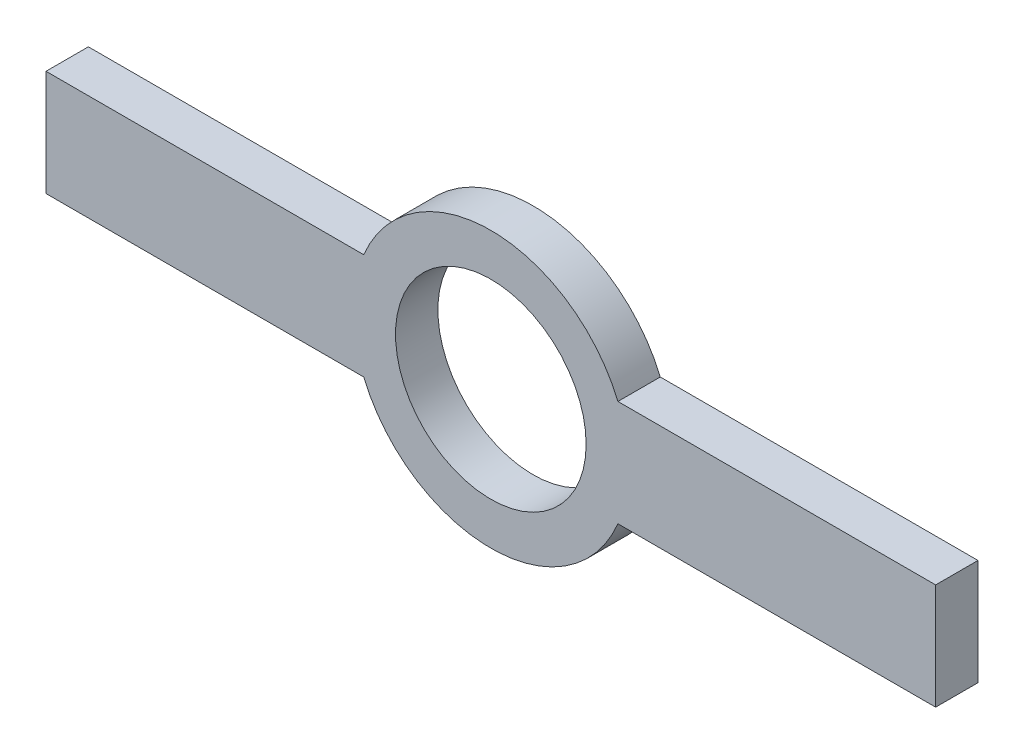
ISO-10303-21;
HEADER;
FILE_DESCRIPTION(('STEP AP214'),'2;1');
FILE_NAME('part.step','',(''),(''),'','','');
FILE_SCHEMA(('AUTOMOTIVE_DESIGN { 1 0 10303 214 1 1 1 1 }'));
ENDSEC;
DATA;
#1=APPLICATION_CONTEXT('core data for automotive mechanical design processes');
#2=APPLICATION_PROTOCOL_DEFINITION('international standard','automotive_design',2000,#1);
#3=PRODUCT_CONTEXT('',#1,'mechanical');
#4=PRODUCT('Part','Part','',(#3));
#5=PRODUCT_RELATED_PRODUCT_CATEGORY('part','',(#4));
#6=PRODUCT_DEFINITION_FORMATION('','',#4);
#7=PRODUCT_DEFINITION_CONTEXT('part definition',#1,'design');
#8=PRODUCT_DEFINITION('design','',#6,#7);
#9=PRODUCT_DEFINITION_SHAPE('','',#8);
#10=(LENGTH_UNIT() NAMED_UNIT(*) SI_UNIT(.MILLI.,.METRE.));
#11=(NAMED_UNIT(*) PLANE_ANGLE_UNIT() SI_UNIT($,.RADIAN.));
#12=(NAMED_UNIT(*) SI_UNIT($,.STERADIAN.) SOLID_ANGLE_UNIT());
#13=UNCERTAINTY_MEASURE_WITH_UNIT(LENGTH_MEASURE(1.E-05),#10,'distance_accuracy_value','');
#14=(GEOMETRIC_REPRESENTATION_CONTEXT(3) GLOBAL_UNCERTAINTY_ASSIGNED_CONTEXT((#13)) GLOBAL_UNIT_ASSIGNED_CONTEXT((#10,
#11,#12)) REPRESENTATION_CONTEXT('',''));
#15=CARTESIAN_POINT('',(0.,0.,0.));
#16=DIRECTION('',(0.,0.,1.));
#17=DIRECTION('',(1.,0.,0.));
#18=AXIS2_PLACEMENT_3D('',#15,#16,#17);
#19=CARTESIAN_POINT('',(0.,-2.5,2.));
#20=DIRECTION('',(0.,1.,0.));
#21=DIRECTION('',(0.,0.,1.));
#22=AXIS2_PLACEMENT_3D('',#19,#20,#21);
#23=PLANE('',#22);
#24=DIRECTION('',(1.,0.,0.));
#25=VECTOR('',#24,1.);
#26=CARTESIAN_POINT('',(0.,-2.5,0.));
#27=LINE('',#26,#25);
#28=CARTESIAN_POINT('',(-21.,-2.5,0.));
#29=VERTEX_POINT('',#28);
#30=CARTESIAN_POINT('',(-6.,-2.5,0.));
#31=VERTEX_POINT('',#30);
#32=EDGE_CURVE('E131',#29,#31,#27,.T.);
#33=ORIENTED_EDGE('',*,*,#32,.T.);
#34=DIRECTION('',(0.,0.,-1.));
#35=VECTOR('',#34,1.);
#36=CARTESIAN_POINT('',(-6.,-2.5,2.));
#37=LINE('',#36,#35);
#38=CARTESIAN_POINT('',(-6.,-2.5,2.));
#39=VERTEX_POINT('',#38);
#40=EDGE_CURVE('E11',#39,#31,#37,.T.);
#41=ORIENTED_EDGE('',*,*,#40,.F.);
#42=DIRECTION('',(1.,0.,0.));
#43=VECTOR('',#42,1.);
#44=CARTESIAN_POINT('',(0.,-2.5,2.));
#45=LINE('',#44,#43);
#46=CARTESIAN_POINT('',(-21.,-2.5,2.));
#47=VERTEX_POINT('',#46);
#48=EDGE_CURVE('E150',#47,#39,#45,.T.);
#49=ORIENTED_EDGE('',*,*,#48,.F.);
#50=DIRECTION('',(0.,0.,-1.));
#51=VECTOR('',#50,1.);
#52=CARTESIAN_POINT('',(-21.,-2.5,2.));
#53=LINE('',#52,#51);
#54=EDGE_CURVE('E51',#47,#29,#53,.T.);
#55=ORIENTED_EDGE('',*,*,#54,.T.);
#56=EDGE_LOOP('',(#33,#41,#49,#55));
#57=FACE_BOUND('',#56,.T.);
#58=ADVANCED_FACE('F35',(#57),#23,.F.);
#59=CARTESIAN_POINT('',(0.,0.,2.));
#60=DIRECTION('',(0.,0.,-1.));
#61=DIRECTION('',(-1.,0.,0.));
#62=AXIS2_PLACEMENT_3D('',#59,#60,#61);
#63=CYLINDRICAL_SURFACE('',#62,6.5);
#64=CARTESIAN_POINT('',(0.,0.,0.));
#65=DIRECTION('',(0.,0.,1.));
#66=DIRECTION('',(1.,0.,0.));
#67=AXIS2_PLACEMENT_3D('',#64,#65,#66);
#68=CIRCLE('',#67,6.5);
#69=CARTESIAN_POINT('',(6.,-2.5,0.));
#70=VERTEX_POINT('',#69);
#71=EDGE_CURVE('E133',#31,#70,#68,.T.);
#72=ORIENTED_EDGE('',*,*,#71,.T.);
#73=DIRECTION('',(0.,0.,-1.));
#74=VECTOR('',#73,1.);
#75=CARTESIAN_POINT('',(6.,-2.5,2.));
#76=LINE('',#75,#74);
#77=CARTESIAN_POINT('',(6.,-2.5,2.));
#78=VERTEX_POINT('',#77);
#79=EDGE_CURVE('E43',#78,#70,#76,.T.);
#80=ORIENTED_EDGE('',*,*,#79,.F.);
#81=CARTESIAN_POINT('',(0.,0.,2.));
#82=DIRECTION('',(0.,0.,1.));
#83=DIRECTION('',(1.,0.,0.));
#84=AXIS2_PLACEMENT_3D('',#81,#82,#83);
#85=CIRCLE('',#84,6.5);
#86=EDGE_CURVE('E89',#39,#78,#85,.T.);
#87=ORIENTED_EDGE('',*,*,#86,.F.);
#88=ORIENTED_EDGE('',*,*,#40,.T.);
#89=EDGE_LOOP('',(#72,#80,#87,#88));
#90=FACE_BOUND('',#89,.T.);
#91=ADVANCED_FACE('F199',(#90),#63,.T.);
#92=CARTESIAN_POINT('',(0.,-2.5,2.));
#93=DIRECTION('',(0.,1.,0.));
#94=DIRECTION('',(0.,0.,1.));
#95=AXIS2_PLACEMENT_3D('',#92,#93,#94);
#96=PLANE('',#95);
#97=DIRECTION('',(1.,0.,0.));
#98=VECTOR('',#97,1.);
#99=CARTESIAN_POINT('',(0.,-2.5,0.));
#100=LINE('',#99,#98);
#101=CARTESIAN_POINT('',(21.,-2.5,0.));
#102=VERTEX_POINT('',#101);
#103=EDGE_CURVE('E136',#70,#102,#100,.T.);
#104=ORIENTED_EDGE('',*,*,#103,.T.);
#105=DIRECTION('',(0.,0.,-1.));
#106=VECTOR('',#105,1.);
#107=CARTESIAN_POINT('',(21.,-2.5,2.));
#108=LINE('',#107,#106);
#109=CARTESIAN_POINT('',(21.,-2.5,2.));
#110=VERTEX_POINT('',#109);
#111=EDGE_CURVE('E156',#110,#102,#108,.T.);
#112=ORIENTED_EDGE('',*,*,#111,.F.);
#113=DIRECTION('',(1.,0.,0.));
#114=VECTOR('',#113,1.);
#115=CARTESIAN_POINT('',(0.,-2.5,2.));
#116=LINE('',#115,#114);
#117=EDGE_CURVE('E164',#78,#110,#116,.T.);
#118=ORIENTED_EDGE('',*,*,#117,.F.);
#119=ORIENTED_EDGE('',*,*,#79,.T.);
#120=EDGE_LOOP('',(#104,#112,#118,#119));
#121=FACE_BOUND('',#120,.T.);
#122=ADVANCED_FACE('F162',(#121),#96,.F.);
#123=CARTESIAN_POINT('',(21.,0.,2.));
#124=DIRECTION('',(-1.,0.,0.));
#125=DIRECTION('',(0.,0.,1.));
#126=AXIS2_PLACEMENT_3D('',#123,#124,#125);
#127=PLANE('',#126);
#128=DIRECTION('',(0.,1.,0.));
#129=VECTOR('',#128,1.);
#130=CARTESIAN_POINT('',(21.,0.,0.));
#131=LINE('',#130,#129);
#132=CARTESIAN_POINT('',(21.,2.5,0.));
#133=VERTEX_POINT('',#132);
#134=EDGE_CURVE('E138',#102,#133,#131,.T.);
#135=ORIENTED_EDGE('',*,*,#134,.T.);
#136=DIRECTION('',(0.,0.,-1.));
#137=VECTOR('',#136,1.);
#138=CARTESIAN_POINT('',(21.,2.5,2.));
#139=LINE('',#138,#137);
#140=CARTESIAN_POINT('',(21.,2.5,2.));
#141=VERTEX_POINT('',#140);
#142=EDGE_CURVE('E154',#141,#133,#139,.T.);
#143=ORIENTED_EDGE('',*,*,#142,.F.);
#144=DIRECTION('',(0.,1.,0.));
#145=VECTOR('',#144,1.);
#146=CARTESIAN_POINT('',(21.,0.,2.));
#147=LINE('',#146,#145);
#148=EDGE_CURVE('E173',#110,#141,#147,.T.);
#149=ORIENTED_EDGE('',*,*,#148,.F.);
#150=ORIENTED_EDGE('',*,*,#111,.T.);
#151=EDGE_LOOP('',(#135,#143,#149,#150));
#152=FACE_BOUND('',#151,.T.);
#153=ADVANCED_FACE('F171',(#152),#127,.F.);
#154=CARTESIAN_POINT('',(0.,2.5,2.));
#155=DIRECTION('',(0.,1.,0.));
#156=DIRECTION('',(0.,0.,1.));
#157=AXIS2_PLACEMENT_3D('',#154,#155,#156);
#158=PLANE('',#157);
#159=DIRECTION('',(1.,0.,0.));
#160=VECTOR('',#159,1.);
#161=CARTESIAN_POINT('',(0.,2.5,0.));
#162=LINE('',#161,#160);
#163=CARTESIAN_POINT('',(6.,2.5,0.));
#164=VERTEX_POINT('',#163);
#165=EDGE_CURVE('E141',#164,#133,#162,.T.);
#166=ORIENTED_EDGE('',*,*,#165,.F.);
#167=DIRECTION('',(0.,0.,-1.));
#168=VECTOR('',#167,1.);
#169=CARTESIAN_POINT('',(6.,2.5,2.));
#170=LINE('',#169,#168);
#171=CARTESIAN_POINT('',(6.,2.5,2.));
#172=VERTEX_POINT('',#171);
#173=EDGE_CURVE('E123',#172,#164,#170,.T.);
#174=ORIENTED_EDGE('',*,*,#173,.F.);
#175=DIRECTION('',(1.,0.,0.));
#176=VECTOR('',#175,1.);
#177=CARTESIAN_POINT('',(0.,2.5,2.));
#178=LINE('',#177,#176);
#179=EDGE_CURVE('E113',#172,#141,#178,.T.);
#180=ORIENTED_EDGE('',*,*,#179,.T.);
#181=ORIENTED_EDGE('',*,*,#142,.T.);
#182=EDGE_LOOP('',(#166,#174,#180,#181));
#183=FACE_BOUND('',#182,.T.);
#184=ADVANCED_FACE('F205',(#183),#158,.T.);
#185=CARTESIAN_POINT('',(0.,0.,2.));
#186=DIRECTION('',(0.,0.,-1.));
#187=DIRECTION('',(-1.,0.,0.));
#188=AXIS2_PLACEMENT_3D('',#185,#186,#187);
#189=CYLINDRICAL_SURFACE('',#188,6.5);
#190=CARTESIAN_POINT('',(0.,0.,0.));
#191=DIRECTION('',(0.,0.,1.));
#192=DIRECTION('',(1.,0.,0.));
#193=AXIS2_PLACEMENT_3D('',#190,#191,#192);
#194=CIRCLE('',#193,6.5);
#195=CARTESIAN_POINT('',(-6.,2.5,0.));
#196=VERTEX_POINT('',#195);
#197=EDGE_CURVE('E120',#164,#196,#194,.T.);
#198=ORIENTED_EDGE('',*,*,#197,.T.);
#199=DIRECTION('',(0.,0.,-1.));
#200=VECTOR('',#199,1.);
#201=CARTESIAN_POINT('',(-6.,2.5,2.));
#202=LINE('',#201,#200);
#203=CARTESIAN_POINT('',(-6.,2.5,2.));
#204=VERTEX_POINT('',#203);
#205=EDGE_CURVE('E117',#204,#196,#202,.T.);
#206=ORIENTED_EDGE('',*,*,#205,.F.);
#207=CARTESIAN_POINT('',(0.,0.,2.));
#208=DIRECTION('',(0.,0.,1.));
#209=DIRECTION('',(1.,0.,0.));
#210=AXIS2_PLACEMENT_3D('',#207,#208,#209);
#211=CIRCLE('',#210,6.5);
#212=EDGE_CURVE('E106',#172,#204,#211,.T.);
#213=ORIENTED_EDGE('',*,*,#212,.F.);
#214=ORIENTED_EDGE('',*,*,#173,.T.);
#215=EDGE_LOOP('',(#198,#206,#213,#214));
#216=FACE_BOUND('',#215,.T.);
#217=ADVANCED_FACE('F118',(#216),#189,.T.);
#218=CARTESIAN_POINT('',(0.,2.5,2.));
#219=DIRECTION('',(0.,1.,0.));
#220=DIRECTION('',(0.,0.,1.));
#221=AXIS2_PLACEMENT_3D('',#218,#219,#220);
#222=PLANE('',#221);
#223=DIRECTION('',(1.,0.,0.));
#224=VECTOR('',#223,1.);
#225=CARTESIAN_POINT('',(0.,2.5,0.));
#226=LINE('',#225,#224);
#227=CARTESIAN_POINT('',(-21.,2.5,0.));
#228=VERTEX_POINT('',#227);
#229=EDGE_CURVE('E145',#228,#196,#226,.T.);
#230=ORIENTED_EDGE('',*,*,#229,.F.);
#231=DIRECTION('',(0.,0.,-1.));
#232=VECTOR('',#231,1.);
#233=CARTESIAN_POINT('',(-21.,2.5,2.));
#234=LINE('',#233,#232);
#235=CARTESIAN_POINT('',(-21.,2.5,2.));
#236=VERTEX_POINT('',#235);
#237=EDGE_CURVE('E77',#236,#228,#234,.T.);
#238=ORIENTED_EDGE('',*,*,#237,.F.);
#239=DIRECTION('',(1.,0.,0.));
#240=VECTOR('',#239,1.);
#241=CARTESIAN_POINT('',(0.,2.5,2.));
#242=LINE('',#241,#240);
#243=EDGE_CURVE('E111',#236,#204,#242,.T.);
#244=ORIENTED_EDGE('',*,*,#243,.T.);
#245=ORIENTED_EDGE('',*,*,#205,.T.);
#246=EDGE_LOOP('',(#230,#238,#244,#245));
#247=FACE_BOUND('',#246,.T.);
#248=ADVANCED_FACE('F125',(#247),#222,.T.);
#249=CARTESIAN_POINT('',(-21.,0.,2.));
#250=DIRECTION('',(-1.,0.,0.));
#251=DIRECTION('',(0.,0.,1.));
#252=AXIS2_PLACEMENT_3D('',#249,#250,#251);
#253=PLANE('',#252);
#254=DIRECTION('',(0.,1.,0.));
#255=VECTOR('',#254,1.);
#256=CARTESIAN_POINT('',(-21.,0.,0.));
#257=LINE('',#256,#255);
#258=EDGE_CURVE('E147',#29,#228,#257,.T.);
#259=ORIENTED_EDGE('',*,*,#258,.F.);
#260=ORIENTED_EDGE('',*,*,#54,.F.);
#261=DIRECTION('',(0.,1.,0.));
#262=VECTOR('',#261,1.);
#263=CARTESIAN_POINT('',(-21.,0.,2.));
#264=LINE('',#263,#262);
#265=EDGE_CURVE('E126',#47,#236,#264,.T.);
#266=ORIENTED_EDGE('',*,*,#265,.T.);
#267=ORIENTED_EDGE('',*,*,#237,.T.);
#268=EDGE_LOOP('',(#259,#260,#266,#267));
#269=FACE_BOUND('',#268,.T.);
#270=ADVANCED_FACE('F188',(#269),#253,.T.);
#271=CARTESIAN_POINT('',(0.,0.,2.));
#272=DIRECTION('',(0.,0.,1.));
#273=DIRECTION('',(1.,0.,0.));
#274=AXIS2_PLACEMENT_3D('',#271,#272,#273);
#275=PLANE('',#274);
#276=CARTESIAN_POINT('',(0.,0.,2.));
#277=DIRECTION('',(0.,0.,1.));
#278=DIRECTION('',(1.,0.,0.));
#279=AXIS2_PLACEMENT_3D('',#276,#277,#278);
#280=CIRCLE('',#279,4.5);
#281=CARTESIAN_POINT('',(4.5,0.,2.));
#282=VERTEX_POINT('',#281);
#283=EDGE_CURVE('E181',#282,#282,#280,.T.);
#284=ORIENTED_EDGE('',*,*,#283,.F.);
#285=EDGE_LOOP('',(#284));
#286=FACE_BOUND('',#285,.T.);
#287=ORIENTED_EDGE('',*,*,#48,.T.);
#288=ORIENTED_EDGE('',*,*,#86,.T.);
#289=ORIENTED_EDGE('',*,*,#117,.T.);
#290=ORIENTED_EDGE('',*,*,#148,.T.);
#291=ORIENTED_EDGE('',*,*,#179,.F.);
#292=ORIENTED_EDGE('',*,*,#212,.T.);
#293=ORIENTED_EDGE('',*,*,#243,.F.);
#294=ORIENTED_EDGE('',*,*,#265,.F.);
#295=EDGE_LOOP('',(#287,#288,#289,#290,#291,#292,#293,#294));
#296=FACE_BOUND('',#295,.T.);
#297=ADVANCED_FACE('F108',(#286,#296),#275,.T.);
#298=CARTESIAN_POINT('',(0.,0.,0.));
#299=DIRECTION('',(0.,0.,1.));
#300=DIRECTION('',(1.,0.,0.));
#301=AXIS2_PLACEMENT_3D('',#298,#299,#300);
#302=PLANE('',#301);
#303=CARTESIAN_POINT('',(0.,0.,0.));
#304=DIRECTION('',(0.,0.,1.));
#305=DIRECTION('',(1.,0.,0.));
#306=AXIS2_PLACEMENT_3D('',#303,#304,#305);
#307=CIRCLE('',#306,4.5);
#308=CARTESIAN_POINT('',(4.5,0.,0.));
#309=VERTEX_POINT('',#308);
#310=EDGE_CURVE('E134',#309,#309,#307,.F.);
#311=ORIENTED_EDGE('',*,*,#310,.F.);
#312=EDGE_LOOP('',(#311));
#313=FACE_BOUND('',#312,.T.);
#314=ORIENTED_EDGE('',*,*,#32,.F.);
#315=ORIENTED_EDGE('',*,*,#258,.T.);
#316=ORIENTED_EDGE('',*,*,#229,.T.);
#317=ORIENTED_EDGE('',*,*,#197,.F.);
#318=ORIENTED_EDGE('',*,*,#165,.T.);
#319=ORIENTED_EDGE('',*,*,#134,.F.);
#320=ORIENTED_EDGE('',*,*,#103,.F.);
#321=ORIENTED_EDGE('',*,*,#71,.F.);
#322=EDGE_LOOP('',(#314,#315,#316,#317,#318,#319,#320,#321));
#323=FACE_BOUND('',#322,.T.);
#324=ADVANCED_FACE('F167',(#313,#323),#302,.F.);
#325=CARTESIAN_POINT('',(0.,0.,-12.7279220613579));
#326=DIRECTION('',(0.,0.,1.));
#327=DIRECTION('',(1.,0.,0.));
#328=AXIS2_PLACEMENT_3D('',#325,#326,#327);
#329=CYLINDRICAL_SURFACE('',#328,4.5);
#330=ORIENTED_EDGE('',*,*,#310,.T.);
#331=EDGE_LOOP('',(#330));
#332=FACE_BOUND('',#331,.T.);
#333=ORIENTED_EDGE('',*,*,#283,.T.);
#334=EDGE_LOOP('',(#333));
#335=FACE_BOUND('',#334,.T.);
#336=ADVANCED_FACE('F185',(#332,#335),#329,.F.);
#337=CLOSED_SHELL('',(#58,#91,#122,#153,#184,#217,#248,#270,#297,#324,#336));
#338=MANIFOLD_SOLID_BREP('B2',#337);
#339=ADVANCED_BREP_SHAPE_REPRESENTATION('',(#18,#338),#14);
#340=SHAPE_DEFINITION_REPRESENTATION(#9,#339);
ENDSEC;
END-ISO-10303-21;
